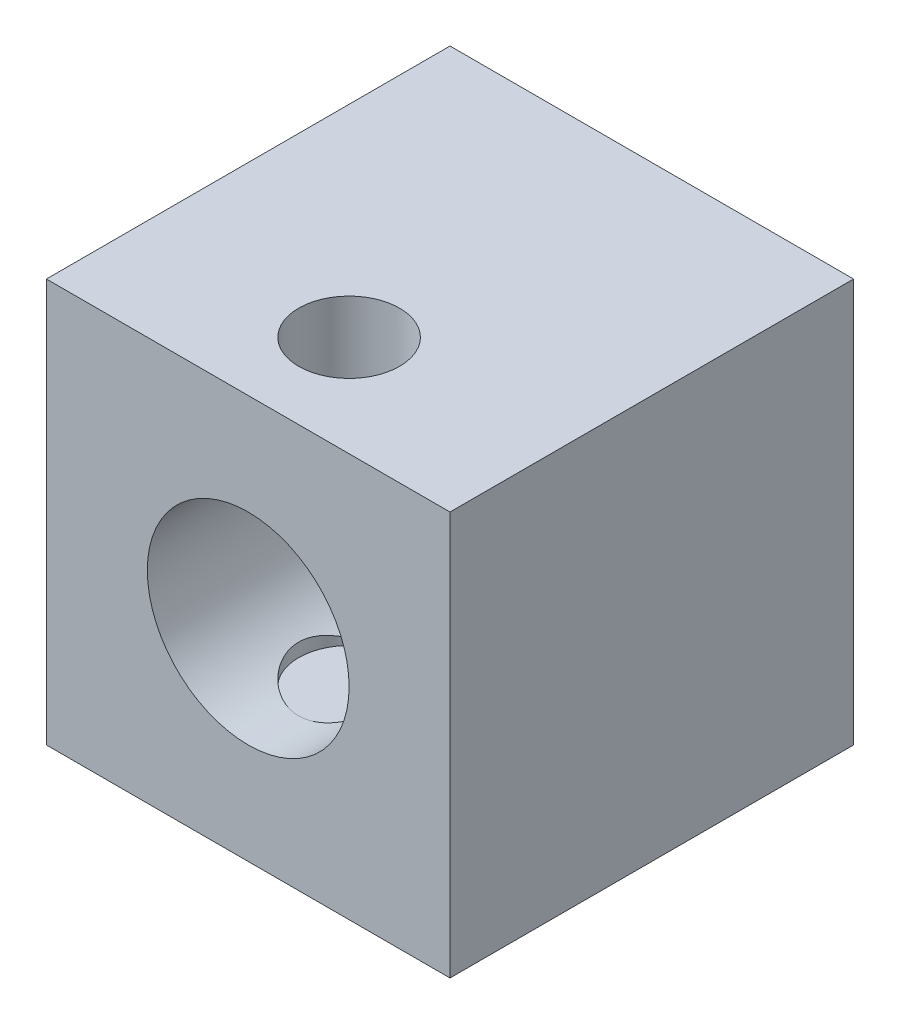
ISO-10303-21;
HEADER;
FILE_DESCRIPTION(('STEP AP214'),'2;1');
FILE_NAME('part.step','',(''),(''),'','','');
FILE_SCHEMA(('AUTOMOTIVE_DESIGN { 1 0 10303 214 1 1 1 1 }'));
ENDSEC;
DATA;
#1=APPLICATION_CONTEXT('core data for automotive mechanical design processes');
#2=APPLICATION_PROTOCOL_DEFINITION('international standard','automotive_design',2000,#1);
#3=PRODUCT_CONTEXT('',#1,'mechanical');
#4=PRODUCT('Part','Part','',(#3));
#5=PRODUCT_RELATED_PRODUCT_CATEGORY('part','',(#4));
#6=PRODUCT_DEFINITION_FORMATION('','',#4);
#7=PRODUCT_DEFINITION_CONTEXT('part definition',#1,'design');
#8=PRODUCT_DEFINITION('design','',#6,#7);
#9=PRODUCT_DEFINITION_SHAPE('','',#8);
#10=(LENGTH_UNIT() NAMED_UNIT(*) SI_UNIT(.MILLI.,.METRE.));
#11=(NAMED_UNIT(*) PLANE_ANGLE_UNIT() SI_UNIT($,.RADIAN.));
#12=(NAMED_UNIT(*) SI_UNIT($,.STERADIAN.) SOLID_ANGLE_UNIT());
#13=UNCERTAINTY_MEASURE_WITH_UNIT(LENGTH_MEASURE(1.E-05),#10,'distance_accuracy_value','');
#14=(GEOMETRIC_REPRESENTATION_CONTEXT(3) GLOBAL_UNCERTAINTY_ASSIGNED_CONTEXT((#13)) GLOBAL_UNIT_ASSIGNED_CONTEXT((#10,
#11,#12)) REPRESENTATION_CONTEXT('',''));
#15=CARTESIAN_POINT('',(0.,0.,0.));
#16=DIRECTION('',(0.,0.,1.));
#17=DIRECTION('',(1.,0.,0.));
#18=AXIS2_PLACEMENT_3D('',#15,#16,#17);
#19=CARTESIAN_POINT('',(0.,0.,40.));
#20=DIRECTION('',(1.,0.,0.));
#21=DIRECTION('',(0.,0.,-1.));
#22=AXIS2_PLACEMENT_3D('',#19,#20,#21);
#23=PLANE('',#22);
#24=DIRECTION('',(0.,-1.,0.));
#25=VECTOR('',#24,1.);
#26=CARTESIAN_POINT('',(0.,0.,0.));
#27=LINE('',#26,#25);
#28=CARTESIAN_POINT('',(0.,40.,0.));
#29=VERTEX_POINT('',#28);
#30=CARTESIAN_POINT('',(0.,0.,0.));
#31=VERTEX_POINT('',#30);
#32=EDGE_CURVE('E120',#29,#31,#27,.T.);
#33=ORIENTED_EDGE('',*,*,#32,.T.);
#34=DIRECTION('',(0.,0.,-1.));
#35=VECTOR('',#34,1.);
#36=CARTESIAN_POINT('',(0.,0.,40.));
#37=LINE('',#36,#35);
#38=CARTESIAN_POINT('',(0.,0.,40.));
#39=VERTEX_POINT('',#38);
#40=EDGE_CURVE('E96',#39,#31,#37,.T.);
#41=ORIENTED_EDGE('',*,*,#40,.F.);
#42=DIRECTION('',(0.,-1.,0.));
#43=VECTOR('',#42,1.);
#44=CARTESIAN_POINT('',(0.,0.,40.));
#45=LINE('',#44,#43);
#46=CARTESIAN_POINT('',(0.,40.,40.));
#47=VERTEX_POINT('',#46);
#48=EDGE_CURVE('E125',#47,#39,#45,.T.);
#49=ORIENTED_EDGE('',*,*,#48,.F.);
#50=DIRECTION('',(0.,0.,-1.));
#51=VECTOR('',#50,1.);
#52=CARTESIAN_POINT('',(0.,40.,40.));
#53=LINE('',#52,#51);
#54=EDGE_CURVE('E131',#47,#29,#53,.T.);
#55=ORIENTED_EDGE('',*,*,#54,.T.);
#56=EDGE_LOOP('',(#33,#41,#49,#55));
#57=FACE_BOUND('',#56,.T.);
#58=ADVANCED_FACE('F33',(#57),#23,.F.);
#59=CARTESIAN_POINT('',(0.,0.,40.));
#60=DIRECTION('',(0.,1.,0.));
#61=DIRECTION('',(0.,0.,1.));
#62=AXIS2_PLACEMENT_3D('',#59,#60,#61);
#63=PLANE('',#62);
#64=DIRECTION('',(1.,0.,0.));
#65=VECTOR('',#64,1.);
#66=CARTESIAN_POINT('',(0.,0.,0.));
#67=LINE('',#66,#65);
#68=CARTESIAN_POINT('',(40.,0.,0.));
#69=VERTEX_POINT('',#68);
#70=EDGE_CURVE('E134',#31,#69,#67,.T.);
#71=ORIENTED_EDGE('',*,*,#70,.T.);
#72=DIRECTION('',(0.,0.,-1.));
#73=VECTOR('',#72,1.);
#74=CARTESIAN_POINT('',(40.,0.,40.));
#75=LINE('',#74,#73);
#76=CARTESIAN_POINT('',(40.,0.,40.));
#77=VERTEX_POINT('',#76);
#78=EDGE_CURVE('E142',#77,#69,#75,.T.);
#79=ORIENTED_EDGE('',*,*,#78,.F.);
#80=DIRECTION('',(1.,0.,0.));
#81=VECTOR('',#80,1.);
#82=CARTESIAN_POINT('',(0.,0.,40.));
#83=LINE('',#82,#81);
#84=EDGE_CURVE('E90',#39,#77,#83,.T.);
#85=ORIENTED_EDGE('',*,*,#84,.F.);
#86=ORIENTED_EDGE('',*,*,#40,.T.);
#87=EDGE_LOOP('',(#71,#79,#85,#86));
#88=FACE_BOUND('',#87,.T.);
#89=ADVANCED_FACE('F159',(#88),#63,.F.);
#90=CARTESIAN_POINT('',(40.,0.,40.));
#91=DIRECTION('',(-1.,0.,0.));
#92=DIRECTION('',(0.,0.,1.));
#93=AXIS2_PLACEMENT_3D('',#90,#91,#92);
#94=PLANE('',#93);
#95=DIRECTION('',(0.,1.,0.));
#96=VECTOR('',#95,1.);
#97=CARTESIAN_POINT('',(40.,0.,0.));
#98=LINE('',#97,#96);
#99=CARTESIAN_POINT('',(40.,40.,0.));
#100=VERTEX_POINT('',#99);
#101=EDGE_CURVE('E136',#69,#100,#98,.T.);
#102=ORIENTED_EDGE('',*,*,#101,.T.);
#103=DIRECTION('',(0.,0.,-1.));
#104=VECTOR('',#103,1.);
#105=CARTESIAN_POINT('',(40.,40.,40.));
#106=LINE('',#105,#104);
#107=CARTESIAN_POINT('',(40.,40.,40.));
#108=VERTEX_POINT('',#107);
#109=EDGE_CURVE('E140',#108,#100,#106,.T.);
#110=ORIENTED_EDGE('',*,*,#109,.F.);
#111=DIRECTION('',(0.,1.,0.));
#112=VECTOR('',#111,1.);
#113=CARTESIAN_POINT('',(40.,0.,40.));
#114=LINE('',#113,#112);
#115=EDGE_CURVE('E128',#77,#108,#114,.T.);
#116=ORIENTED_EDGE('',*,*,#115,.F.);
#117=ORIENTED_EDGE('',*,*,#78,.T.);
#118=EDGE_LOOP('',(#102,#110,#116,#117));
#119=FACE_BOUND('',#118,.T.);
#120=ADVANCED_FACE('F164',(#119),#94,.F.);
#121=CARTESIAN_POINT('',(0.,40.,40.));
#122=DIRECTION('',(0.,-1.,0.));
#123=DIRECTION('',(0.,0.,-1.));
#124=AXIS2_PLACEMENT_3D('',#121,#122,#123);
#125=PLANE('',#124);
#126=CARTESIAN_POINT('',(20.,40.,30.));
#127=DIRECTION('',(0.,1.,0.));
#128=DIRECTION('',(0.,0.,1.));
#129=AXIS2_PLACEMENT_3D('',#126,#127,#128);
#130=CIRCLE('',#129,5.);
#131=CARTESIAN_POINT('',(20.,40.,35.));
#132=VERTEX_POINT('',#131);
#133=EDGE_CURVE('E102',#132,#132,#130,.T.);
#134=ORIENTED_EDGE('',*,*,#133,.F.);
#135=EDGE_LOOP('',(#134));
#136=FACE_BOUND('',#135,.T.);
#137=DIRECTION('',(-1.,0.,0.));
#138=VECTOR('',#137,1.);
#139=CARTESIAN_POINT('',(0.,40.,0.));
#140=LINE('',#139,#138);
#141=EDGE_CURVE('E82',#100,#29,#140,.T.);
#142=ORIENTED_EDGE('',*,*,#141,.T.);
#143=ORIENTED_EDGE('',*,*,#54,.F.);
#144=DIRECTION('',(-1.,0.,0.));
#145=VECTOR('',#144,1.);
#146=CARTESIAN_POINT('',(0.,40.,40.));
#147=LINE('',#146,#145);
#148=EDGE_CURVE('E61',#108,#47,#147,.T.);
#149=ORIENTED_EDGE('',*,*,#148,.F.);
#150=ORIENTED_EDGE('',*,*,#109,.T.);
#151=EDGE_LOOP('',(#142,#143,#149,#150));
#152=FACE_BOUND('',#151,.T.);
#153=ADVANCED_FACE('F175',(#136,#152),#125,.F.);
#154=CARTESIAN_POINT('',(0.,0.,40.));
#155=DIRECTION('',(0.,0.,-1.));
#156=DIRECTION('',(-1.,0.,0.));
#157=AXIS2_PLACEMENT_3D('',#154,#155,#156);
#158=PLANE('',#157);
#159=CARTESIAN_POINT('',(20.,20.,40.));
#160=DIRECTION('',(0.,0.,1.));
#161=DIRECTION('',(1.,0.,0.));
#162=AXIS2_PLACEMENT_3D('',#159,#160,#161);
#163=CIRCLE('',#162,10.);
#164=CARTESIAN_POINT('',(30.,20.,40.));
#165=VERTEX_POINT('',#164);
#166=EDGE_CURVE('E117',#165,#165,#163,.T.);
#167=ORIENTED_EDGE('',*,*,#166,.F.);
#168=EDGE_LOOP('',(#167));
#169=FACE_BOUND('',#168,.T.);
#170=ORIENTED_EDGE('',*,*,#48,.T.);
#171=ORIENTED_EDGE('',*,*,#84,.T.);
#172=ORIENTED_EDGE('',*,*,#115,.T.);
#173=ORIENTED_EDGE('',*,*,#148,.T.);
#174=EDGE_LOOP('',(#170,#171,#172,#173));
#175=FACE_BOUND('',#174,.T.);
#176=ADVANCED_FACE('F173',(#169,#175),#158,.F.);
#177=CARTESIAN_POINT('',(0.,0.,0.));
#178=DIRECTION('',(0.,0.,-1.));
#179=DIRECTION('',(-1.,0.,0.));
#180=AXIS2_PLACEMENT_3D('',#177,#178,#179);
#181=PLANE('',#180);
#182=CARTESIAN_POINT('',(20.,20.,0.));
#183=DIRECTION('',(0.,0.,1.));
#184=DIRECTION('',(1.,0.,0.));
#185=AXIS2_PLACEMENT_3D('',#182,#183,#184);
#186=CIRCLE('',#185,10.);
#187=CARTESIAN_POINT('',(30.,20.,0.));
#188=VERTEX_POINT('',#187);
#189=EDGE_CURVE('E114',#188,#188,#186,.T.);
#190=ORIENTED_EDGE('',*,*,#189,.T.);
#191=EDGE_LOOP('',(#190));
#192=FACE_BOUND('',#191,.T.);
#193=ORIENTED_EDGE('',*,*,#32,.F.);
#194=ORIENTED_EDGE('',*,*,#141,.F.);
#195=ORIENTED_EDGE('',*,*,#101,.F.);
#196=ORIENTED_EDGE('',*,*,#70,.F.);
#197=EDGE_LOOP('',(#193,#194,#195,#196));
#198=FACE_BOUND('',#197,.T.);
#199=ADVANCED_FACE('F109',(#192,#198),#181,.T.);
#200=CARTESIAN_POINT('',(20.,20.,0.));
#201=DIRECTION('',(0.,0.,1.));
#202=DIRECTION('',(1.,0.,0.));
#203=AXIS2_PLACEMENT_3D('',#200,#201,#202);
#204=CYLINDRICAL_SURFACE('',#203,10.);
#205=CARTESIAN_POINT('',(20.,30.,35.));
#206=CARTESIAN_POINT('',(20.1314888900787,29.9999996017189,34.999999567784));
#207=CARTESIAN_POINT('',(20.2629869702172,29.9974005312128,34.9948072247149));
#208=CARTESIAN_POINT('',(20.5250145863481,29.9870697783517,34.974097105888));
#209=CARTESIAN_POINT('',(20.6555436760033,29.9793358631493,34.958574838236));
#210=CARTESIAN_POINT('',(20.9147832034311,29.95892066969,34.9173592205227));
#211=CARTESIAN_POINT('',(21.0434907753526,29.9462323364288,34.8916513655938));
#212=CARTESIAN_POINT('',(21.2980263675429,29.9162271657667,34.8303493274365));
#213=CARTESIAN_POINT('',(21.4238531878169,29.8989084363038,34.7947511025944));
#214=CARTESIAN_POINT('',(21.6712138658497,29.860154301548,34.7142215175487));
#215=CARTESIAN_POINT('',(21.7927639909456,29.8387370967076,34.669331351452));
#216=CARTESIAN_POINT('',(22.0314444775119,29.7922442748932,34.570551202193));
#217=CARTESIAN_POINT('',(22.1485731551167,29.7671672814684,34.5166578318065));
#218=CARTESIAN_POINT('',(22.4922256141291,29.6873086048874,34.342200371061));
#219=CARTESIAN_POINT('',(22.711288461153,29.6278546021617,34.2087692267599));
#220=CARTESIAN_POINT('',(23.1375804575512,29.4978066342416,33.9023947187554));
#221=CARTESIAN_POINT('',(23.3432919297287,29.4267563267135,33.7275493097203));
#222=CARTESIAN_POINT('',(23.7238813381811,29.2830021447525,33.3474109117168));
#223=CARTESIAN_POINT('',(23.8987357783256,29.2102970574354,33.1420949380162));
#224=CARTESIAN_POINT('',(24.2262838562005,29.0649386733299,32.6875248525357));
#225=CARTESIAN_POINT('',(24.3762073476669,28.992726641703,32.4360981086825));
#226=CARTESIAN_POINT('',(24.5672336524387,28.8963741754668,32.0400819556324));
#227=CARTESIAN_POINT('',(24.62527981131,28.8662427968472,31.9048817094397));
#228=CARTESIAN_POINT('',(24.7294884357826,28.8110961162722,31.6289987482259));
#229=CARTESIAN_POINT('',(24.7756579374427,28.7860777870196,31.4883193363608));
#230=CARTESIAN_POINT('',(24.8531380584616,28.7435056236206,31.211007245844));
#231=CARTESIAN_POINT('',(24.8851676229696,28.7255970410888,31.0746295200221));
#232=CARTESIAN_POINT('',(24.9377257389241,28.6959633371111,30.7990743025204));
#233=CARTESIAN_POINT('',(24.9582603923665,28.6842349351524,30.6598983369939));
#234=CARTESIAN_POINT('',(24.9875239895894,28.6674616108702,30.3799925388888));
#235=CARTESIAN_POINT('',(24.9962600432976,28.6624126634929,30.2392636936859));
#236=CARTESIAN_POINT('',(25.0018039949405,28.6592129963894,29.9574988237104));
#237=CARTESIAN_POINT('',(24.998613030925,28.6610616185123,29.8164628295286));
#238=CARTESIAN_POINT('',(24.9814580309285,28.6709372717359,29.552296427123));
#239=CARTESIAN_POINT('',(24.9688320837109,28.6781966350113,29.4290473971898));
#240=CARTESIAN_POINT('',(24.9345440266222,28.6977390699662,29.1841787860329));
#241=CARTESIAN_POINT('',(24.9128790786833,28.7100237194627,29.0625597289781));
#242=CARTESIAN_POINT('',(24.8607627829265,28.7392147957695,28.8218021256872));
#243=CARTESIAN_POINT('',(24.830312519889,28.7561206519556,28.70266327515));
#244=CARTESIAN_POINT('',(24.7609431915997,28.7940307398461,28.4675286230456));
#245=CARTESIAN_POINT('',(24.7220207985686,28.8150365816534,28.3515340767239));
#246=CARTESIAN_POINT('',(24.591086613585,28.8843603242164,28.0039931283814));
#247=CARTESIAN_POINT('',(24.4860878582589,28.9382879183352,27.7783066439621));
#248=CARTESIAN_POINT('',(24.2451959100276,29.055174330786,27.3467898817771));
#249=CARTESIAN_POINT('',(24.1092888401335,29.1181372010103,27.1409685822408));
#250=CARTESIAN_POINT('',(23.7903442231033,29.2556545575908,26.7274114717962));
#251=CARTESIAN_POINT('',(23.6035157164288,29.3306665420313,26.5227419922927));
#252=CARTESIAN_POINT('',(23.1977344484325,29.4773901391005,26.1462965343113));
#253=CARTESIAN_POINT('',(22.978766422206,29.549100162058,25.9745362761788));
#254=CARTESIAN_POINT('',(22.6243060009878,29.6503450658222,25.7415591028868));
#255=CARTESIAN_POINT('',(22.4987100233616,29.6837038027426,25.6666479048545));
#256=CARTESIAN_POINT('',(22.2407106014256,29.7466305271847,25.5277917970276));
#257=CARTESIAN_POINT('',(22.1083100575541,29.7762001113578,25.4638422644089));
#258=CARTESIAN_POINT('',(21.837628033148,29.8306755351055,25.3476011246166));
#259=CARTESIAN_POINT('',(21.6993489468218,29.8555832514495,25.2953048244752));
#260=CARTESIAN_POINT('',(21.4179118789608,29.899990264575,25.20297507092));
#261=CARTESIAN_POINT('',(21.2747544607899,29.9194901835038,25.1629402068178));
#262=CARTESIAN_POINT('',(20.9967980154304,29.9510959732819,25.098466436497));
#263=CARTESIAN_POINT('',(20.8622886740298,29.9636804633433,25.0730104845976));
#264=CARTESIAN_POINT('',(20.5912483600125,29.9834303573227,25.0331919587764));
#265=CARTESIAN_POINT('',(20.454717567194,29.990596240282,25.0188284042099));
#266=CARTESIAN_POINT('',(20.1808107093596,29.9993038048736,25.0013868379659));
#267=CARTESIAN_POINT('',(20.0434349881359,30.000847639673,24.9983045057331));
#268=CARTESIAN_POINT('',(19.7689523914184,29.9982723785904,25.0034555739187));
#269=CARTESIAN_POINT('',(19.6318455042957,29.9941535333264,25.0116884735493));
#270=CARTESIAN_POINT('',(19.3696759760477,29.9809097308245,25.038278673841));
#271=CARTESIAN_POINT('',(19.2445062487568,29.9721992224311,25.0557983775934));
#272=CARTESIAN_POINT('',(18.996195739132,29.9502722735272,25.1001744735706));
#273=CARTESIAN_POINT('',(18.8730556123999,29.9370544058358,25.1270338230932));
#274=CARTESIAN_POINT('',(18.6296769282787,29.9064245040412,25.1898026833625));
#275=CARTESIAN_POINT('',(18.5094374952982,29.8890137534627,25.2257094246781));
#276=CARTESIAN_POINT('',(18.2725205313246,29.8503936814887,25.3062281613232));
#277=CARTESIAN_POINT('',(18.1558443846432,29.8291829052407,25.3508434913527));
#278=CARTESIAN_POINT('',(17.8056964552772,29.7592287641658,25.4999478068503));
#279=CARTESIAN_POINT('',(17.5788867915106,29.7050490447818,25.6179407417851));
#280=CARTESIAN_POINT('',(17.1476543984192,29.5871937574559,25.8855521932197));
#281=CARTESIAN_POINT('',(16.9432412622653,29.5235141477638,26.0351841819923));
#282=CARTESIAN_POINT('',(16.5411786732497,29.385415053921,26.3787872910366));
#283=CARTESIAN_POINT('',(16.3461646658005,29.31055499362,26.5756695917524));
#284=CARTESIAN_POINT('',(15.9906933232203,29.1631088175914,26.999670537134));
#285=CARTESIAN_POINT('',(15.8302598934933,29.0905243043733,27.2268099239983));
#286=CARTESIAN_POINT('',(15.6153398308079,28.9878526058262,27.5924905662293));
#287=CARTESIAN_POINT('',(15.5467323773288,28.9539595524138,27.7218508745435));
#288=CARTESIAN_POINT('',(15.4208188773732,28.8902235241508,27.986894100779));
#289=CARTESIAN_POINT('',(15.3635077121111,28.8603787168037,28.1225741203759));
#290=CARTESIAN_POINT('',(15.260860009251,28.8059032736563,28.3992770353252));
#291=CARTESIAN_POINT('',(15.215513685576,28.7812683799473,28.54029545575));
#292=CARTESIAN_POINT('',(15.137349956669,28.7382281909816,28.8266910428248));
#293=CARTESIAN_POINT('',(15.1045306115289,28.7198219312185,28.9720675308275));
#294=CARTESIAN_POINT('',(15.0544616520706,28.6915127567139,29.2517649815353));
#295=CARTESIAN_POINT('',(15.0360200256656,28.6809632703526,29.38580788312));
#296=CARTESIAN_POINT('',(15.0100612679387,28.6660682453958,29.6552852456974));
#297=CARTESIAN_POINT('',(15.00254299203,28.6617220567978,29.7907195593952));
#298=CARTESIAN_POINT('',(14.9985452264825,28.6594142565673,30.0617569250046));
#299=CARTESIAN_POINT('',(15.002061856724,28.6614504007635,30.1973599008496));
#300=CARTESIAN_POINT('',(15.0200702579605,28.6718168178582,30.4675855579479));
#301=CARTESIAN_POINT('',(15.0345615796566,28.6801468330883,30.6022082791045));
#302=CARTESIAN_POINT('',(15.0724024237278,28.701678287448,30.856560202159));
#303=CARTESIAN_POINT('',(15.09477233985,28.7143377090885,30.9764825596239));
#304=CARTESIAN_POINT('',(15.1480562325681,28.7441159948052,31.2138611905675));
#305=CARTESIAN_POINT('',(15.1789728513128,28.7612362378164,31.331316689334));
#306=CARTESIAN_POINT('',(15.2840969392604,28.8185423186872,31.6789171151129));
#307=CARTESIAN_POINT('',(15.3707029101584,28.8646881377113,31.904456094986));
#308=CARTESIAN_POINT('',(15.5809283532498,28.9714289095461,32.3531603423125));
#309=CARTESIAN_POINT('',(15.7066436631797,29.0327863364739,32.5751480759894));
#310=CARTESIAN_POINT('',(15.9892457898926,29.1617663649522,32.9963641095957));
#311=CARTESIAN_POINT('',(16.1461488239227,29.2293922162046,33.1955804834442));
#312=CARTESIAN_POINT('',(16.5089725103559,29.3731144460079,33.5907078584707));
#313=CARTESIAN_POINT('',(16.718532636574,29.4492416290591,33.7832760187676));
#314=CARTESIAN_POINT('',(17.1692712423259,29.5938951497154,34.1313344211833));
#315=CARTESIAN_POINT('',(17.4104666566387,29.6624173797604,34.2868046777436));
#316=CARTESIAN_POINT('',(17.7924611811463,29.7541901337583,34.4886304145268));
#317=CARTESIAN_POINT('',(17.9237448742973,29.7830420998029,34.5508670794064));
#318=CARTESIAN_POINT('',(18.19200470066,29.8361474523456,34.6639361561204));
#319=CARTESIAN_POINT('',(18.3289779979485,29.8604030970797,34.7147741705306));
#320=CARTESIAN_POINT('',(18.6073049893131,29.9035448412872,34.8043454383672));
#321=CARTESIAN_POINT('',(18.7486483765292,29.9224426437939,34.8431050929877));
#322=CARTESIAN_POINT('',(19.0347627942044,29.9543461811201,34.9081375962686));
#323=CARTESIAN_POINT('',(19.1795316739516,29.9673555148968,34.934418072527));
#324=CARTESIAN_POINT('',(19.4369583455918,29.9847638787872,34.9694745319989));
#325=CARTESIAN_POINT('',(19.54917419027,29.9904674160167,34.980911753692));
#326=CARTESIAN_POINT('',(19.7742577539497,29.9980856998602,34.9961747782501));
#327=CARTESIAN_POINT('',(19.8871254908578,30.000000341898,35.0000003710289));
#328=CARTESIAN_POINT('',(20.,30.,35.));
#329=B_SPLINE_CURVE_WITH_KNOTS('',3,(#205,#206,#207,#208,#209,#210,#211,#212,#213,#214,#215,
#216,#217,#218,#219,#220,#221,#222,#223,#224,#225,#226,#227,#228,#229,#230,#231,#232,#233,#234,
#235,#236,#237,#238,#239,#240,#241,#242,#243,#244,#245,#246,#247,#248,#249,#250,#251,#252,#253,
#254,#255,#256,#257,#258,#259,#260,#261,#262,#263,#264,#265,#266,#267,#268,#269,#270,#271,#272,
#273,#274,#275,#276,#277,#278,#279,#280,#281,#282,#283,#284,#285,#286,#287,#288,#289,#290,#291,
#292,#293,#294,#295,#296,#297,#298,#299,#300,#301,#302,#303,#304,#305,#306,#307,#308,#309,#310,
#311,#312,#313,#314,#315,#316,#317,#318,#319,#320,#321,#322,#323,#324,#325,#326,#327,#328),
.UNSPECIFIED.,.T.,.F.,(4,2,2,2,2,2,2,2,2,2,2,2,2,2,2,2,2,2,2,2,2,2,2,2,2,2,2,2,2,2,2,2,2,2,2,2,
2,2,2,2,2,2,2,2,2,2,2,2,2,2,2,2,2,2,2,2,2,2,2,2,2,4),(0.,0.394355294649891,0.788882184037819,
1.18397293369035,1.57922537181693,1.97276168530543,2.36644639154632,3.15295441699267,
3.98704440767527,4.82176680235501,5.72122193562245,6.17125359989458,6.62101803579305,
7.04410338623952,7.46696393118358,7.88956954321096,8.3121348321667,8.68401534897463,
9.05601271689169,9.42796417149685,9.8000619899096,10.56083380205,11.3219478566368,
12.1795688603196,13.03759852356,13.4870830845772,13.9363776171859,14.3854908824168,
14.8345524573652,15.2464230691107,15.6582572644723,16.0699337163998,16.4815919489941,
16.8612200640511,17.240968493866,17.6206008225791,18.0003788066131,18.7808755264614,
19.5617052624835,20.4192132572739,21.2773121558255,21.7277011924366,22.1778856687596,
22.6277007885002,23.0774462222894,23.4840267197959,23.8905646113036,24.2969595710184,
24.703337894006,25.0708552370355,25.4384863225851,26.1732662495599,26.9574126491567,
27.7419678673239,28.6218519479817,29.5022089791541,29.9460734671028,30.3897193096443,
30.8323885049027,31.2747867798493,31.6133053554877,31.9518332743451),.UNSPECIFIED.);
#330=CARTESIAN_POINT('',(20.,30.,35.));
#331=VERTEX_POINT('',#330);
#332=EDGE_CURVE('E36',#331,#331,#329,.T.);
#333=ORIENTED_EDGE('',*,*,#332,.T.);
#334=EDGE_LOOP('',(#333));
#335=FACE_BOUND('',#334,.T.);
#336=CARTESIAN_POINT('',(20.,9.99999999999999,35.));
#337=CARTESIAN_POINT('',(19.8685111099213,10.0000003982811,34.999999567784));
#338=CARTESIAN_POINT('',(19.7370130297828,10.0025994687872,34.9948072247149));
#339=CARTESIAN_POINT('',(19.4749854136519,10.0129302216483,34.974097105888));
#340=CARTESIAN_POINT('',(19.3444563239967,10.0206641368507,34.958574838236));
#341=CARTESIAN_POINT('',(19.0852167965689,10.04107933031,34.9173592205227));
#342=CARTESIAN_POINT('',(18.9565092246474,10.0537676635712,34.8916513655938));
#343=CARTESIAN_POINT('',(18.7019736324571,10.0837728342333,34.8303493274365));
#344=CARTESIAN_POINT('',(18.5761468121831,10.1010915636962,34.7947511025944));
#345=CARTESIAN_POINT('',(18.3287861341503,10.139845698452,34.7142215175487));
#346=CARTESIAN_POINT('',(18.2072360090544,10.1612629032924,34.669331351452));
#347=CARTESIAN_POINT('',(17.9685555224881,10.2077557251068,34.5705512021931));
#348=CARTESIAN_POINT('',(17.8514268448833,10.2328327185316,34.5166578318066));
#349=CARTESIAN_POINT('',(17.5077743858709,10.3126913951126,34.342200371061));
#350=CARTESIAN_POINT('',(17.288711538847,10.3721453978383,34.2087692267599));
#351=CARTESIAN_POINT('',(16.8624195424488,10.5021933657584,33.9023947187554));
#352=CARTESIAN_POINT('',(16.6567080702713,10.5732436732865,33.7275493097203));
#353=CARTESIAN_POINT('',(16.2761186618189,10.7169978552475,33.3474109117168));
#354=CARTESIAN_POINT('',(16.1012642216744,10.7897029425646,33.1420949380162));
#355=CARTESIAN_POINT('',(15.7737161437995,10.9350613266701,32.6875248525357));
#356=CARTESIAN_POINT('',(15.6237926523331,11.007273358297,32.4360981086825));
#357=CARTESIAN_POINT('',(15.4327663475613,11.1036258245332,32.0400819556324));
#358=CARTESIAN_POINT('',(15.37472018869,11.1337572031528,31.9048817094397));
#359=CARTESIAN_POINT('',(15.2705115642174,11.1889038837278,31.6289987482259));
#360=CARTESIAN_POINT('',(15.2243420625573,11.2139222129804,31.4883193363608));
#361=CARTESIAN_POINT('',(15.1468619415384,11.2564943763794,31.211007245844));
#362=CARTESIAN_POINT('',(15.1148323770304,11.2744029589112,31.0746295200221));
#363=CARTESIAN_POINT('',(15.0622742610759,11.3040366628889,30.7990743025204));
#364=CARTESIAN_POINT('',(15.0417396076335,11.3157650648476,30.6598983369939));
#365=CARTESIAN_POINT('',(15.0124760104106,11.3325383891298,30.3799925388888));
#366=CARTESIAN_POINT('',(15.0037399567024,11.3375873365071,30.2392636936859));
#367=CARTESIAN_POINT('',(14.9981960050595,11.3407870036105,29.9574988237104));
#368=CARTESIAN_POINT('',(15.001386969075,11.3389383814877,29.8164628295286));
#369=CARTESIAN_POINT('',(15.0185419690715,11.3290627282641,29.552296427123));
#370=CARTESIAN_POINT('',(15.0311679162891,11.3218033649887,29.4290473971898));
#371=CARTESIAN_POINT('',(15.0654559733778,11.3022609300338,29.1841787860329));
#372=CARTESIAN_POINT('',(15.0871209213167,11.2899762805373,29.0625597289781));
#373=CARTESIAN_POINT('',(15.1392372170735,11.2607852042305,28.8218021256872));
#374=CARTESIAN_POINT('',(15.169687480111,11.2438793480444,28.70266327515));
#375=CARTESIAN_POINT('',(15.2390568084003,11.2059692601539,28.4675286230456));
#376=CARTESIAN_POINT('',(15.2779792014314,11.1849634183466,28.3515340767239));
#377=CARTESIAN_POINT('',(15.408913386415,11.1156396757836,28.0039931283814));
#378=CARTESIAN_POINT('',(15.5139121417411,11.0617120816648,27.7783066439621));
#379=CARTESIAN_POINT('',(15.7548040899724,10.944825669214,27.3467898817771));
#380=CARTESIAN_POINT('',(15.8907111598665,10.8818627989897,27.1409685822408));
#381=CARTESIAN_POINT('',(16.2096557768967,10.7443454424092,26.7274114717962));
#382=CARTESIAN_POINT('',(16.3964842835712,10.6693334579687,26.5227419922927));
#383=CARTESIAN_POINT('',(16.8022655515675,10.5226098608995,26.1462965343113));
#384=CARTESIAN_POINT('',(17.021233577794,10.450899837942,25.9745362761788));
#385=CARTESIAN_POINT('',(17.3756939990122,10.3496549341778,25.7415591028868));
#386=CARTESIAN_POINT('',(17.5012899766384,10.3162961972574,25.6666479048545));
#387=CARTESIAN_POINT('',(17.7592893985744,10.2533694728153,25.5277917970276));
#388=CARTESIAN_POINT('',(17.8916899424459,10.2237998886422,25.4638422644089));
#389=CARTESIAN_POINT('',(18.162371966852,10.1693244648945,25.3476011246166));
#390=CARTESIAN_POINT('',(18.3006510531782,10.1444167485505,25.2953048244752));
#391=CARTESIAN_POINT('',(18.5820881210392,10.100009735425,25.20297507092));
#392=CARTESIAN_POINT('',(18.7252455392101,10.0805098164962,25.1629402068178));
#393=CARTESIAN_POINT('',(19.0032019845696,10.0489040267181,25.098466436497));
#394=CARTESIAN_POINT('',(19.1377113259702,10.0363195366567,25.0730104845976));
#395=CARTESIAN_POINT('',(19.4087516399875,10.0165696426773,25.0331919587764));
#396=CARTESIAN_POINT('',(19.545282432806,10.009403759718,25.0188284042099));
#397=CARTESIAN_POINT('',(19.8191892906404,10.0006961951264,25.0013868379659));
#398=CARTESIAN_POINT('',(19.9565650118641,9.99915236032699,24.9983045057331));
#399=CARTESIAN_POINT('',(20.2310476085816,10.0017276214096,25.0034555739187));
#400=CARTESIAN_POINT('',(20.3681544957043,10.0058464666736,25.0116884735493));
#401=CARTESIAN_POINT('',(20.6303240239522,10.0190902691755,25.038278673841));
#402=CARTESIAN_POINT('',(20.7554937512432,10.0278007775689,25.0557983775934));
#403=CARTESIAN_POINT('',(21.003804260868,10.0497277264728,25.1001744735706));
#404=CARTESIAN_POINT('',(21.1269443876001,10.0629455941642,25.1270338230932));
#405=CARTESIAN_POINT('',(21.3703230717213,10.0935754959588,25.1898026833625));
#406=CARTESIAN_POINT('',(21.4905625047018,10.1109862465373,25.2257094246781));
#407=CARTESIAN_POINT('',(21.7274794686754,10.1496063185113,25.3062281613232));
#408=CARTESIAN_POINT('',(21.8441556153568,10.1708170947593,25.3508434913527));
#409=CARTESIAN_POINT('',(22.1943035447228,10.2407712358342,25.4999478068503));
#410=CARTESIAN_POINT('',(22.4211132084894,10.2949509552182,25.6179407417851));
#411=CARTESIAN_POINT('',(22.8523456015808,10.4128062425441,25.8855521932197));
#412=CARTESIAN_POINT('',(23.0567587377347,10.4764858522362,26.0351841819923));
#413=CARTESIAN_POINT('',(23.4588213267503,10.614584946079,26.3787872910366));
#414=CARTESIAN_POINT('',(23.6538353341995,10.68944500638,26.5756695917524));
#415=CARTESIAN_POINT('',(24.0093066767797,10.8368911824086,26.999670537134));
#416=CARTESIAN_POINT('',(24.1697401065066,10.9094756956267,27.2268099239983));
#417=CARTESIAN_POINT('',(24.3846601691921,11.0121473941738,27.5924905662293));
#418=CARTESIAN_POINT('',(24.4532676226712,11.0460404475862,27.7218508745435));
#419=CARTESIAN_POINT('',(24.5791811226268,11.1097764758492,27.986894100779));
#420=CARTESIAN_POINT('',(24.6364922878889,11.1396212831963,28.1225741203759));
#421=CARTESIAN_POINT('',(24.739139990749,11.1940967263437,28.3992770353252));
#422=CARTESIAN_POINT('',(24.784486314424,11.2187316200527,28.54029545575));
#423=CARTESIAN_POINT('',(24.862650043331,11.2617718090184,28.8266910428248));
#424=CARTESIAN_POINT('',(24.8954693884711,11.2801780687815,28.9720675308275));
#425=CARTESIAN_POINT('',(24.9455383479294,11.3084872432861,29.2517649815353));
#426=CARTESIAN_POINT('',(24.9639799743344,11.3190367296474,29.38580788312));
#427=CARTESIAN_POINT('',(24.9899387320613,11.3339317546042,29.6552852456974));
#428=CARTESIAN_POINT('',(24.99745700797,11.3382779432022,29.7907195593952));
#429=CARTESIAN_POINT('',(25.0014547735175,11.3405857434327,30.0617569250046));
#430=CARTESIAN_POINT('',(24.997938143276,11.3385495992365,30.1973599008496));
#431=CARTESIAN_POINT('',(24.9799297420395,11.3281831821418,30.4675855579479));
#432=CARTESIAN_POINT('',(24.9654384203434,11.3198531669117,30.6022082791045));
#433=CARTESIAN_POINT('',(24.9275975762722,11.298321712552,30.856560202159));
#434=CARTESIAN_POINT('',(24.90522766015,11.2856622909115,30.9764825596239));
#435=CARTESIAN_POINT('',(24.8519437674319,11.2558840051948,31.2138611905675));
#436=CARTESIAN_POINT('',(24.8210271486872,11.2387637621836,31.331316689334));
#437=CARTESIAN_POINT('',(24.7159030607396,11.1814576813128,31.6789171151129));
#438=CARTESIAN_POINT('',(24.6292970898416,11.1353118622887,31.904456094986));
#439=CARTESIAN_POINT('',(24.4190716467502,11.0285710904539,32.3531603423125));
#440=CARTESIAN_POINT('',(24.2933563368203,10.9672136635261,32.5751480759894));
#441=CARTESIAN_POINT('',(24.0107542101074,10.8382336350478,32.9963641095957));
#442=CARTESIAN_POINT('',(23.8538511760773,10.7706077837954,33.1955804834442));
#443=CARTESIAN_POINT('',(23.4910274896441,10.6268855539921,33.5907078584707));
#444=CARTESIAN_POINT('',(23.281467363426,10.5507583709409,33.7832760187676));
#445=CARTESIAN_POINT('',(22.8307287576741,10.4061048502846,34.1313344211833));
#446=CARTESIAN_POINT('',(22.5895333433613,10.3375826202396,34.2868046777436));
#447=CARTESIAN_POINT('',(22.2075388188537,10.2458098662417,34.4886304145268));
#448=CARTESIAN_POINT('',(22.0762551257027,10.2169579001971,34.5508670794064));
#449=CARTESIAN_POINT('',(21.80799529934,10.1638525476544,34.6639361561204));
#450=CARTESIAN_POINT('',(21.6710220020515,10.1395969029203,34.7147741705306));
#451=CARTESIAN_POINT('',(21.3926950106869,10.0964551587128,34.8043454383672));
#452=CARTESIAN_POINT('',(21.2513516234708,10.0775573562061,34.8431050929877));
#453=CARTESIAN_POINT('',(20.9652372057956,10.0456538188799,34.9081375962686));
#454=CARTESIAN_POINT('',(20.8204683260484,10.0326444851032,34.934418072527));
#455=CARTESIAN_POINT('',(20.5630416544082,10.0152361212128,34.9694745319989));
#456=CARTESIAN_POINT('',(20.45082580973,10.0095325839833,34.980911753692));
#457=CARTESIAN_POINT('',(20.2257422460503,10.0019143001398,34.9961747782501));
#458=CARTESIAN_POINT('',(20.1128745091422,9.99999965810199,35.0000003710289));
#459=CARTESIAN_POINT('',(20.,9.99999999999999,35.));
#460=B_SPLINE_CURVE_WITH_KNOTS('',3,(#336,#337,#338,#339,#340,#341,#342,#343,#344,#345,#346,
#347,#348,#349,#350,#351,#352,#353,#354,#355,#356,#357,#358,#359,#360,#361,#362,#363,#364,#365,
#366,#367,#368,#369,#370,#371,#372,#373,#374,#375,#376,#377,#378,#379,#380,#381,#382,#383,#384,
#385,#386,#387,#388,#389,#390,#391,#392,#393,#394,#395,#396,#397,#398,#399,#400,#401,#402,#403,
#404,#405,#406,#407,#408,#409,#410,#411,#412,#413,#414,#415,#416,#417,#418,#419,#420,#421,#422,
#423,#424,#425,#426,#427,#428,#429,#430,#431,#432,#433,#434,#435,#436,#437,#438,#439,#440,#441,
#442,#443,#444,#445,#446,#447,#448,#449,#450,#451,#452,#453,#454,#455,#456,#457,#458,#459),
.UNSPECIFIED.,.T.,.F.,(4,2,2,2,2,2,2,2,2,2,2,2,2,2,2,2,2,2,2,2,2,2,2,2,2,2,2,2,2,2,2,2,2,2,2,2,
2,2,2,2,2,2,2,2,2,2,2,2,2,2,2,2,2,2,2,2,2,2,2,2,2,4),(0.,0.394355294649891,0.788882184037819,
1.18397293369035,1.57922537181693,1.97276168530542,2.36644639154631,3.15295441699266,
3.98704440767528,4.82176680235501,5.72122193562246,6.1712535998946,6.62101803579305,
7.04410338623953,7.46696393118359,7.88956954321097,8.3121348321667,8.68401534897463,
9.05601271689168,9.42796417149685,9.8000619899096,10.56083380205,11.3219478566368,
12.1795688603196,13.03759852356,13.4870830845772,13.9363776171859,14.3854908824168,
14.8345524573652,15.2464230691107,15.6582572644723,16.0699337163998,16.4815919489941,
16.8612200640511,17.240968493866,17.6206008225791,18.0003788066131,18.7808755264614,
19.5617052624835,20.4192132572739,21.2773121558255,21.7277011924365,22.1778856687596,
22.6277007885002,23.0774462222894,23.4840267197959,23.8905646113036,24.2969595710184,
24.703337894006,25.0708552370355,25.4384863225851,26.1732662495599,26.9574126491567,
27.7419678673239,28.6218519479817,29.5022089791541,29.9460734671028,30.3897193096443,
30.8323885049027,31.2747867798493,31.6133053554877,31.9518332743451),.UNSPECIFIED.);
#461=CARTESIAN_POINT('',(20.,9.99999999999999,25.));
#462=VERTEX_POINT('',#461);
#463=CARTESIAN_POINT('',(20.,9.99999999999999,35.));
#464=VERTEX_POINT('',#463);
#465=EDGE_CURVE('E46',#462,#464,#460,.T.);
#466=ORIENTED_EDGE('',*,*,#465,.T.);
#467=EDGE_CURVE('E11',#464,#462,#460,.T.);
#468=ORIENTED_EDGE('',*,*,#467,.T.);
#469=EDGE_LOOP('',(#466,#468));
#470=FACE_BOUND('',#469,.T.);
#471=ORIENTED_EDGE('',*,*,#189,.F.);
#472=EDGE_LOOP('',(#471));
#473=FACE_BOUND('',#472,.T.);
#474=ORIENTED_EDGE('',*,*,#166,.T.);
#475=EDGE_LOOP('',(#474));
#476=FACE_BOUND('',#475,.T.);
#477=ADVANCED_FACE('F105',(#335,#470,#473,#476),#204,.F.);
#478=CARTESIAN_POINT('',(20.,9.99999999999999,30.));
#479=DIRECTION('',(0.,1.,0.));
#480=DIRECTION('',(0.,0.,1.));
#481=AXIS2_PLACEMENT_3D('',#478,#479,#480);
#482=CYLINDRICAL_SURFACE('',#481,5.);
#483=ORIENTED_EDGE('',*,*,#133,.T.);
#484=EDGE_LOOP('',(#483));
#485=FACE_BOUND('',#484,.T.);
#486=ORIENTED_EDGE('',*,*,#332,.F.);
#487=EDGE_LOOP('',(#486));
#488=FACE_BOUND('',#487,.T.);
#489=ADVANCED_FACE('F108',(#485,#488),#482,.F.);
#490=CARTESIAN_POINT('',(20.,9.99999999999999,30.));
#491=DIRECTION('',(0.,1.,0.));
#492=DIRECTION('',(0.,0.,1.));
#493=AXIS2_PLACEMENT_3D('',#490,#491,#492);
#494=CIRCLE('',#493,5.);
#495=EDGE_CURVE('E99',#462,#464,#494,.T.);
#496=ORIENTED_EDGE('',*,*,#495,.F.);
#497=ORIENTED_EDGE('',*,*,#467,.F.);
#498=EDGE_LOOP('',(#496,#497));
#499=FACE_BOUND('',#498,.T.);
#500=ADVANCED_FACE('F100',(#499),#482,.F.);
#501=EDGE_CURVE('E52',#464,#462,#494,.T.);
#502=ORIENTED_EDGE('',*,*,#501,.F.);
#503=ORIENTED_EDGE('',*,*,#465,.F.);
#504=EDGE_LOOP('',(#502,#503));
#505=FACE_BOUND('',#504,.T.);
#506=ADVANCED_FACE('F94',(#505),#482,.F.);
#507=CARTESIAN_POINT('',(20.,9.99999999999999,30.));
#508=DIRECTION('',(0.,1.,0.));
#509=DIRECTION('',(0.,0.,1.));
#510=AXIS2_PLACEMENT_3D('',#507,#508,#509);
#511=PLANE('',#510);
#512=ORIENTED_EDGE('',*,*,#495,.T.);
#513=ORIENTED_EDGE('',*,*,#501,.T.);
#514=EDGE_LOOP('',(#512,#513));
#515=FACE_BOUND('',#514,.T.);
#516=ADVANCED_FACE('F104',(#515),#511,.T.);
#517=CLOSED_SHELL('',(#58,#89,#120,#153,#176,#199,#477,#489,#500,#506,#516));
#518=MANIFOLD_SOLID_BREP('B2',#517);
#519=ADVANCED_BREP_SHAPE_REPRESENTATION('',(#18,#518),#14);
#520=SHAPE_DEFINITION_REPRESENTATION(#9,#519);
ENDSEC;
END-ISO-10303-21;
